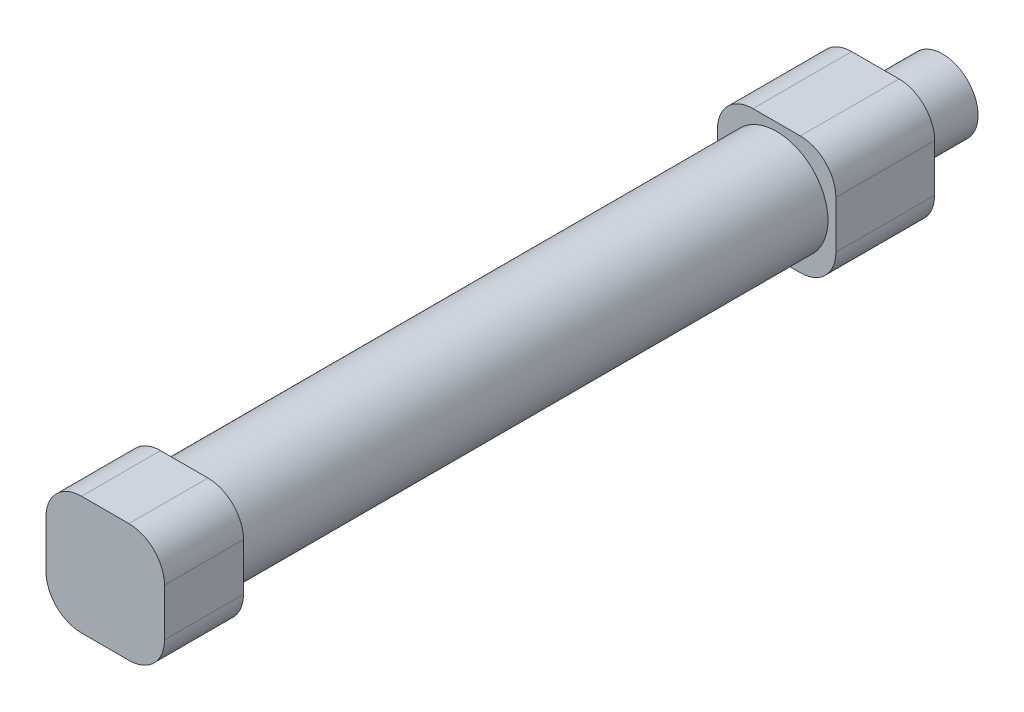
ISO-10303-21;
HEADER;
FILE_DESCRIPTION(('STEP AP214'),'2;1');
FILE_NAME('part.step','',(''),(''),'','','');
FILE_SCHEMA(('AUTOMOTIVE_DESIGN { 1 0 10303 214 1 1 1 1 }'));
ENDSEC;
DATA;
#1=APPLICATION_CONTEXT('core data for automotive mechanical design processes');
#2=APPLICATION_PROTOCOL_DEFINITION('international standard','automotive_design',2000,#1);
#3=PRODUCT_CONTEXT('',#1,'mechanical');
#4=PRODUCT('Part','Part','',(#3));
#5=PRODUCT_RELATED_PRODUCT_CATEGORY('part','',(#4));
#6=PRODUCT_DEFINITION_FORMATION('','',#4);
#7=PRODUCT_DEFINITION_CONTEXT('part definition',#1,'design');
#8=PRODUCT_DEFINITION('design','',#6,#7);
#9=PRODUCT_DEFINITION_SHAPE('','',#8);
#10=(LENGTH_UNIT() NAMED_UNIT(*) SI_UNIT(.MILLI.,.METRE.));
#11=(NAMED_UNIT(*) PLANE_ANGLE_UNIT() SI_UNIT($,.RADIAN.));
#12=(NAMED_UNIT(*) SI_UNIT($,.STERADIAN.) SOLID_ANGLE_UNIT());
#13=UNCERTAINTY_MEASURE_WITH_UNIT(LENGTH_MEASURE(1.E-05),#10,'distance_accuracy_value','');
#14=(GEOMETRIC_REPRESENTATION_CONTEXT(3) GLOBAL_UNCERTAINTY_ASSIGNED_CONTEXT((#13)) GLOBAL_UNIT_ASSIGNED_CONTEXT((#10,
#11,#12)) REPRESENTATION_CONTEXT('',''));
#15=CARTESIAN_POINT('',(0.,0.,0.));
#16=DIRECTION('',(0.,0.,1.));
#17=DIRECTION('',(1.,0.,0.));
#18=AXIS2_PLACEMENT_3D('',#15,#16,#17);
#19=CARTESIAN_POINT('',(7.5,-7.5,10.));
#20=DIRECTION('',(-1.,0.,0.));
#21=DIRECTION('',(0.,0.,1.));
#22=AXIS2_PLACEMENT_3D('',#19,#20,#21);
#23=PLANE('',#22);
#24=DIRECTION('',(0.,1.,0.));
#25=VECTOR('',#24,1.);
#26=CARTESIAN_POINT('',(7.5,-7.5,10.));
#27=LINE('',#26,#25);
#28=CARTESIAN_POINT('',(7.5,-3.,10.));
#29=VERTEX_POINT('',#28);
#30=CARTESIAN_POINT('',(7.5,3.,10.));
#31=VERTEX_POINT('',#30);
#32=EDGE_CURVE('E180',#29,#31,#27,.T.);
#33=ORIENTED_EDGE('',*,*,#32,.F.);
#34=DIRECTION('',(0.,0.,-1.));
#35=VECTOR('',#34,1.);
#36=CARTESIAN_POINT('',(7.5,-3.,10.));
#37=LINE('',#36,#35);
#38=CARTESIAN_POINT('',(7.5,-3.,0.));
#39=VERTEX_POINT('',#38);
#40=EDGE_CURVE('E212',#29,#39,#37,.T.);
#41=ORIENTED_EDGE('',*,*,#40,.T.);
#42=DIRECTION('',(0.,1.,0.));
#43=VECTOR('',#42,1.);
#44=CARTESIAN_POINT('',(7.5,-7.5,0.));
#45=LINE('',#44,#43);
#46=CARTESIAN_POINT('',(7.5,3.,0.));
#47=VERTEX_POINT('',#46);
#48=EDGE_CURVE('E281',#39,#47,#45,.T.);
#49=ORIENTED_EDGE('',*,*,#48,.T.);
#50=DIRECTION('',(0.,0.,-1.));
#51=VECTOR('',#50,1.);
#52=CARTESIAN_POINT('',(7.5,3.,10.));
#53=LINE('',#52,#51);
#54=EDGE_CURVE('E210',#47,#31,#53,.F.);
#55=ORIENTED_EDGE('',*,*,#54,.T.);
#56=EDGE_LOOP('',(#33,#41,#49,#55));
#57=FACE_BOUND('',#56,.T.);
#58=ADVANCED_FACE('F37',(#57),#23,.F.);
#59=CARTESIAN_POINT('',(-7.5,7.5,10.));
#60=DIRECTION('',(0.,-1.,0.));
#61=DIRECTION('',(0.,0.,-1.));
#62=AXIS2_PLACEMENT_3D('',#59,#60,#61);
#63=PLANE('',#62);
#64=DIRECTION('',(-1.,0.,0.));
#65=VECTOR('',#64,1.);
#66=CARTESIAN_POINT('',(-7.5,7.5,0.));
#67=LINE('',#66,#65);
#68=CARTESIAN_POINT('',(3.,7.5,0.));
#69=VERTEX_POINT('',#68);
#70=CARTESIAN_POINT('',(-3.,7.5,0.));
#71=VERTEX_POINT('',#70);
#72=EDGE_CURVE('E186',#69,#71,#67,.T.);
#73=ORIENTED_EDGE('',*,*,#72,.T.);
#74=DIRECTION('',(0.,0.,-1.));
#75=VECTOR('',#74,1.);
#76=CARTESIAN_POINT('',(-3.,7.5,10.));
#77=LINE('',#76,#75);
#78=CARTESIAN_POINT('',(-3.,7.5,10.));
#79=VERTEX_POINT('',#78);
#80=EDGE_CURVE('E208',#71,#79,#77,.F.);
#81=ORIENTED_EDGE('',*,*,#80,.T.);
#82=DIRECTION('',(-1.,0.,0.));
#83=VECTOR('',#82,1.);
#84=CARTESIAN_POINT('',(-7.5,7.5,10.));
#85=LINE('',#84,#83);
#86=CARTESIAN_POINT('',(3.,7.5,10.));
#87=VERTEX_POINT('',#86);
#88=EDGE_CURVE('E184',#87,#79,#85,.T.);
#89=ORIENTED_EDGE('',*,*,#88,.F.);
#90=DIRECTION('',(0.,0.,-1.));
#91=VECTOR('',#90,1.);
#92=CARTESIAN_POINT('',(3.,7.5,10.));
#93=LINE('',#92,#91);
#94=EDGE_CURVE('E205',#87,#69,#93,.T.);
#95=ORIENTED_EDGE('',*,*,#94,.T.);
#96=EDGE_LOOP('',(#73,#81,#89,#95));
#97=FACE_BOUND('',#96,.T.);
#98=ADVANCED_FACE('F295',(#97),#63,.F.);
#99=CARTESIAN_POINT('',(-7.5,-7.5,10.));
#100=DIRECTION('',(1.,0.,0.));
#101=DIRECTION('',(0.,0.,-1.));
#102=AXIS2_PLACEMENT_3D('',#99,#100,#101);
#103=PLANE('',#102);
#104=CARTESIAN_POINT('',(-7.5,0.,5.));
#105=DIRECTION('',(-1.,0.,0.));
#106=DIRECTION('',(0.,0.,1.));
#107=AXIS2_PLACEMENT_3D('',#104,#105,#106);
#108=CIRCLE('',#107,2.5);
#109=CARTESIAN_POINT('',(-7.5,0.,7.5));
#110=VERTEX_POINT('',#109);
#111=EDGE_CURVE('E274',#110,#110,#108,.T.);
#112=ORIENTED_EDGE('',*,*,#111,.F.);
#113=EDGE_LOOP('',(#112));
#114=FACE_BOUND('',#113,.T.);
#115=DIRECTION('',(0.,-1.,0.));
#116=VECTOR('',#115,1.);
#117=CARTESIAN_POINT('',(-7.5,-7.5,0.));
#118=LINE('',#117,#116);
#119=CARTESIAN_POINT('',(-7.5,3.,0.));
#120=VERTEX_POINT('',#119);
#121=CARTESIAN_POINT('',(-7.5,-3.,0.));
#122=VERTEX_POINT('',#121);
#123=EDGE_CURVE('E181',#120,#122,#118,.T.);
#124=ORIENTED_EDGE('',*,*,#123,.T.);
#125=DIRECTION('',(0.,0.,-1.));
#126=VECTOR('',#125,1.);
#127=CARTESIAN_POINT('',(-7.5,-3.,10.));
#128=LINE('',#127,#126);
#129=CARTESIAN_POINT('',(-7.5,-3.,10.));
#130=VERTEX_POINT('',#129);
#131=EDGE_CURVE('E158',#122,#130,#128,.F.);
#132=ORIENTED_EDGE('',*,*,#131,.T.);
#133=DIRECTION('',(0.,-1.,0.));
#134=VECTOR('',#133,1.);
#135=CARTESIAN_POINT('',(-7.5,-7.5,10.));
#136=LINE('',#135,#134);
#137=CARTESIAN_POINT('',(-7.5,3.,10.));
#138=VERTEX_POINT('',#137);
#139=EDGE_CURVE('E286',#138,#130,#136,.T.);
#140=ORIENTED_EDGE('',*,*,#139,.F.);
#141=DIRECTION('',(0.,0.,-1.));
#142=VECTOR('',#141,1.);
#143=CARTESIAN_POINT('',(-7.5,3.,10.));
#144=LINE('',#143,#142);
#145=EDGE_CURVE('E163',#138,#120,#144,.T.);
#146=ORIENTED_EDGE('',*,*,#145,.T.);
#147=EDGE_LOOP('',(#124,#132,#140,#146));
#148=FACE_BOUND('',#147,.T.);
#149=ADVANCED_FACE('F306',(#114,#148),#103,.F.);
#150=CARTESIAN_POINT('',(-7.5,-7.5,10.));
#151=DIRECTION('',(0.,1.,0.));
#152=DIRECTION('',(0.,0.,1.));
#153=AXIS2_PLACEMENT_3D('',#150,#151,#152);
#154=PLANE('',#153);
#155=DIRECTION('',(1.,0.,0.));
#156=VECTOR('',#155,1.);
#157=CARTESIAN_POINT('',(-7.5,-7.5,10.));
#158=LINE('',#157,#156);
#159=CARTESIAN_POINT('',(-3.,-7.5,10.));
#160=VERTEX_POINT('',#159);
#161=CARTESIAN_POINT('',(3.,-7.5,10.));
#162=VERTEX_POINT('',#161);
#163=EDGE_CURVE('E173',#160,#162,#158,.T.);
#164=ORIENTED_EDGE('',*,*,#163,.F.);
#165=DIRECTION('',(0.,0.,-1.));
#166=VECTOR('',#165,1.);
#167=CARTESIAN_POINT('',(-3.,-7.5,10.));
#168=LINE('',#167,#166);
#169=CARTESIAN_POINT('',(-3.,-7.5,0.));
#170=VERTEX_POINT('',#169);
#171=EDGE_CURVE('E157',#160,#170,#168,.T.);
#172=ORIENTED_EDGE('',*,*,#171,.T.);
#173=DIRECTION('',(1.,0.,0.));
#174=VECTOR('',#173,1.);
#175=CARTESIAN_POINT('',(-7.5,-7.5,0.));
#176=LINE('',#175,#174);
#177=CARTESIAN_POINT('',(3.,-7.5,0.));
#178=VERTEX_POINT('',#177);
#179=EDGE_CURVE('E170',#170,#178,#176,.T.);
#180=ORIENTED_EDGE('',*,*,#179,.T.);
#181=DIRECTION('',(0.,0.,-1.));
#182=VECTOR('',#181,1.);
#183=CARTESIAN_POINT('',(3.,-7.5,10.));
#184=LINE('',#183,#182);
#185=EDGE_CURVE('E175',#178,#162,#184,.F.);
#186=ORIENTED_EDGE('',*,*,#185,.T.);
#187=EDGE_LOOP('',(#164,#172,#180,#186));
#188=FACE_BOUND('',#187,.T.);
#189=ADVANCED_FACE('F169',(#188),#154,.F.);
#190=CARTESIAN_POINT('',(0.,0.,10.));
#191=DIRECTION('',(0.,0.,-1.));
#192=DIRECTION('',(-1.,0.,0.));
#193=AXIS2_PLACEMENT_3D('',#190,#191,#192);
#194=PLANE('',#193);
#195=ORIENTED_EDGE('',*,*,#139,.T.);
#196=CARTESIAN_POINT('',(-3.,-3.,10.));
#197=DIRECTION('',(0.,0.,-1.));
#198=DIRECTION('',(-1.,0.,0.));
#199=AXIS2_PLACEMENT_3D('',#196,#197,#198);
#200=CIRCLE('',#199,4.5);
#201=EDGE_CURVE('E203',#130,#160,#200,.F.);
#202=ORIENTED_EDGE('',*,*,#201,.T.);
#203=ORIENTED_EDGE('',*,*,#163,.T.);
#204=CARTESIAN_POINT('',(3.,-3.,10.));
#205=DIRECTION('',(0.,0.,-1.));
#206=DIRECTION('',(-1.,0.,0.));
#207=AXIS2_PLACEMENT_3D('',#204,#205,#206);
#208=CIRCLE('',#207,4.5);
#209=EDGE_CURVE('E199',#162,#29,#208,.F.);
#210=ORIENTED_EDGE('',*,*,#209,.T.);
#211=ORIENTED_EDGE('',*,*,#32,.T.);
#212=CARTESIAN_POINT('',(3.,3.,10.));
#213=DIRECTION('',(0.,0.,-1.));
#214=DIRECTION('',(-1.,0.,0.));
#215=AXIS2_PLACEMENT_3D('',#212,#213,#214);
#216=CIRCLE('',#215,4.5);
#217=EDGE_CURVE('E197',#31,#87,#216,.F.);
#218=ORIENTED_EDGE('',*,*,#217,.T.);
#219=ORIENTED_EDGE('',*,*,#88,.T.);
#220=CARTESIAN_POINT('',(-3.,3.,10.));
#221=DIRECTION('',(0.,0.,-1.));
#222=DIRECTION('',(-1.,0.,0.));
#223=AXIS2_PLACEMENT_3D('',#220,#221,#222);
#224=CIRCLE('',#223,4.5);
#225=EDGE_CURVE('E201',#79,#138,#224,.F.);
#226=ORIENTED_EDGE('',*,*,#225,.T.);
#227=EDGE_LOOP('',(#195,#202,#203,#210,#211,#218,#219,#226));
#228=FACE_BOUND('',#227,.T.);
#229=ADVANCED_FACE('F304',(#228),#194,.F.);
#230=CARTESIAN_POINT('',(0.,0.,0.));
#231=DIRECTION('',(0.,0.,-1.));
#232=DIRECTION('',(-1.,0.,0.));
#233=AXIS2_PLACEMENT_3D('',#230,#231,#232);
#234=PLANE('',#233);
#235=CARTESIAN_POINT('',(0.,0.,0.));
#236=DIRECTION('',(0.,0.,-1.));
#237=DIRECTION('',(-1.,0.,0.));
#238=AXIS2_PLACEMENT_3D('',#235,#236,#237);
#239=CIRCLE('',#238,6.5);
#240=CARTESIAN_POINT('',(-6.5,0.,0.));
#241=VERTEX_POINT('',#240);
#242=EDGE_CURVE('E215',#241,#241,#239,.T.);
#243=ORIENTED_EDGE('',*,*,#242,.F.);
#244=EDGE_LOOP('',(#243));
#245=FACE_BOUND('',#244,.T.);
#246=ORIENTED_EDGE('',*,*,#179,.F.);
#247=CARTESIAN_POINT('',(-3.,-3.,0.));
#248=DIRECTION('',(0.,0.,-1.));
#249=DIRECTION('',(-1.,0.,0.));
#250=AXIS2_PLACEMENT_3D('',#247,#248,#249);
#251=CIRCLE('',#250,4.5);
#252=EDGE_CURVE('E153',#170,#122,#251,.T.);
#253=ORIENTED_EDGE('',*,*,#252,.T.);
#254=ORIENTED_EDGE('',*,*,#123,.F.);
#255=CARTESIAN_POINT('',(-3.,3.,0.));
#256=DIRECTION('',(0.,0.,-1.));
#257=DIRECTION('',(-1.,0.,0.));
#258=AXIS2_PLACEMENT_3D('',#255,#256,#257);
#259=CIRCLE('',#258,4.5);
#260=EDGE_CURVE('E164',#120,#71,#259,.T.);
#261=ORIENTED_EDGE('',*,*,#260,.T.);
#262=ORIENTED_EDGE('',*,*,#72,.F.);
#263=CARTESIAN_POINT('',(3.,3.,0.));
#264=DIRECTION('',(0.,0.,-1.));
#265=DIRECTION('',(-1.,0.,0.));
#266=AXIS2_PLACEMENT_3D('',#263,#264,#265);
#267=CIRCLE('',#266,4.5);
#268=EDGE_CURVE('E174',#69,#47,#267,.T.);
#269=ORIENTED_EDGE('',*,*,#268,.T.);
#270=ORIENTED_EDGE('',*,*,#48,.F.);
#271=CARTESIAN_POINT('',(3.,-3.,0.));
#272=DIRECTION('',(0.,0.,-1.));
#273=DIRECTION('',(-1.,0.,0.));
#274=AXIS2_PLACEMENT_3D('',#271,#272,#273);
#275=CIRCLE('',#274,4.5);
#276=EDGE_CURVE('E179',#39,#178,#275,.T.);
#277=ORIENTED_EDGE('',*,*,#276,.T.);
#278=EDGE_LOOP('',(#246,#253,#254,#261,#262,#269,#270,#277));
#279=FACE_BOUND('',#278,.T.);
#280=ADVANCED_FACE('F177',(#245,#279),#234,.T.);
#281=CARTESIAN_POINT('',(-3.,-3.,10.));
#282=DIRECTION('',(0.,0.,-1.));
#283=DIRECTION('',(-1.,0.,0.));
#284=AXIS2_PLACEMENT_3D('',#281,#282,#283);
#285=CYLINDRICAL_SURFACE('',#284,4.5);
#286=ORIENTED_EDGE('',*,*,#201,.F.);
#287=ORIENTED_EDGE('',*,*,#131,.F.);
#288=ORIENTED_EDGE('',*,*,#252,.F.);
#289=ORIENTED_EDGE('',*,*,#171,.F.);
#290=EDGE_LOOP('',(#286,#287,#288,#289));
#291=FACE_BOUND('',#290,.T.);
#292=ADVANCED_FACE('F156',(#291),#285,.T.);
#293=CARTESIAN_POINT('',(-3.,3.,10.));
#294=DIRECTION('',(0.,0.,-1.));
#295=DIRECTION('',(-1.,0.,0.));
#296=AXIS2_PLACEMENT_3D('',#293,#294,#295);
#297=CYLINDRICAL_SURFACE('',#296,4.5);
#298=ORIENTED_EDGE('',*,*,#225,.F.);
#299=ORIENTED_EDGE('',*,*,#80,.F.);
#300=ORIENTED_EDGE('',*,*,#260,.F.);
#301=ORIENTED_EDGE('',*,*,#145,.F.);
#302=EDGE_LOOP('',(#298,#299,#300,#301));
#303=FACE_BOUND('',#302,.T.);
#304=ADVANCED_FACE('F300',(#303),#297,.T.);
#305=CARTESIAN_POINT('',(3.,-3.,10.));
#306=DIRECTION('',(0.,0.,-1.));
#307=DIRECTION('',(-1.,0.,0.));
#308=AXIS2_PLACEMENT_3D('',#305,#306,#307);
#309=CYLINDRICAL_SURFACE('',#308,4.5);
#310=ORIENTED_EDGE('',*,*,#209,.F.);
#311=ORIENTED_EDGE('',*,*,#185,.F.);
#312=ORIENTED_EDGE('',*,*,#276,.F.);
#313=ORIENTED_EDGE('',*,*,#40,.F.);
#314=EDGE_LOOP('',(#310,#311,#312,#313));
#315=FACE_BOUND('',#314,.T.);
#316=ADVANCED_FACE('F328',(#315),#309,.T.);
#317=CARTESIAN_POINT('',(3.,3.,10.));
#318=DIRECTION('',(0.,0.,-1.));
#319=DIRECTION('',(-1.,0.,0.));
#320=AXIS2_PLACEMENT_3D('',#317,#318,#319);
#321=CYLINDRICAL_SURFACE('',#320,4.5);
#322=ORIENTED_EDGE('',*,*,#217,.F.);
#323=ORIENTED_EDGE('',*,*,#54,.F.);
#324=ORIENTED_EDGE('',*,*,#268,.F.);
#325=ORIENTED_EDGE('',*,*,#94,.F.);
#326=EDGE_LOOP('',(#322,#323,#324,#325));
#327=FACE_BOUND('',#326,.T.);
#328=ADVANCED_FACE('F331',(#327),#321,.T.);
#329=CARTESIAN_POINT('',(-2.7,0.,5.));
#330=DIRECTION('',(-1.,0.,0.));
#331=DIRECTION('',(0.,0.,1.));
#332=AXIS2_PLACEMENT_3D('',#329,#330,#331);
#333=CYLINDRICAL_SURFACE('',#332,2.5);
#334=CARTESIAN_POINT('',(-2.7,0.,5.));
#335=DIRECTION('',(-1.,0.,0.));
#336=DIRECTION('',(0.,0.,1.));
#337=AXIS2_PLACEMENT_3D('',#334,#335,#336);
#338=CIRCLE('',#337,2.5);
#339=CARTESIAN_POINT('',(-2.7,0.,7.5));
#340=VERTEX_POINT('',#339);
#341=EDGE_CURVE('E278',#340,#340,#338,.T.);
#342=ORIENTED_EDGE('',*,*,#341,.F.);
#343=EDGE_LOOP('',(#342));
#344=FACE_BOUND('',#343,.T.);
#345=ORIENTED_EDGE('',*,*,#111,.T.);
#346=EDGE_LOOP('',(#345));
#347=FACE_BOUND('',#346,.T.);
#348=ADVANCED_FACE('F335',(#344,#347),#333,.F.);
#349=CARTESIAN_POINT('',(-2.7,0.,5.));
#350=DIRECTION('',(-1.,0.,0.));
#351=DIRECTION('',(0.,0.,1.));
#352=AXIS2_PLACEMENT_3D('',#349,#350,#351);
#353=PLANE('',#352);
#354=ORIENTED_EDGE('',*,*,#341,.T.);
#355=EDGE_LOOP('',(#354));
#356=FACE_BOUND('',#355,.T.);
#357=ADVANCED_FACE('F393',(#356),#353,.T.);
#358=CARTESIAN_POINT('',(0.,0.,-75.));
#359=DIRECTION('',(0.,0.,1.));
#360=DIRECTION('',(1.,0.,0.));
#361=AXIS2_PLACEMENT_3D('',#358,#359,#360);
#362=CYLINDRICAL_SURFACE('',#361,6.5);
#363=CARTESIAN_POINT('',(0.,0.,-75.));
#364=DIRECTION('',(0.,0.,-1.));
#365=DIRECTION('',(-1.,0.,0.));
#366=AXIS2_PLACEMENT_3D('',#363,#364,#365);
#367=CIRCLE('',#366,6.5);
#368=CARTESIAN_POINT('',(-6.5,0.,-75.));
#369=VERTEX_POINT('',#368);
#370=EDGE_CURVE('E271',#369,#369,#367,.T.);
#371=ORIENTED_EDGE('',*,*,#370,.F.);
#372=EDGE_LOOP('',(#371));
#373=FACE_BOUND('',#372,.T.);
#374=ORIENTED_EDGE('',*,*,#242,.T.);
#375=EDGE_LOOP('',(#374));
#376=FACE_BOUND('',#375,.T.);
#377=ADVANCED_FACE('F389',(#373,#376),#362,.T.);
#378=CARTESIAN_POINT('',(-7.5,-7.5,-87.5));
#379=DIRECTION('',(1.,0.,0.));
#380=DIRECTION('',(0.,0.,-1.));
#381=AXIS2_PLACEMENT_3D('',#378,#379,#380);
#382=PLANE('',#381);
#383=CARTESIAN_POINT('',(-7.5,0.,-79.5));
#384=DIRECTION('',(-1.,0.,0.));
#385=DIRECTION('',(0.,0.,1.));
#386=AXIS2_PLACEMENT_3D('',#383,#384,#385);
#387=CIRCLE('',#386,2.49999999999999);
#388=CARTESIAN_POINT('',(-7.5,0.,-77.));
#389=VERTEX_POINT('',#388);
#390=EDGE_CURVE('E571',#389,#389,#387,.T.);
#391=ORIENTED_EDGE('',*,*,#390,.F.);
#392=EDGE_LOOP('',(#391));
#393=FACE_BOUND('',#392,.T.);
#394=DIRECTION('',(0.,1.,0.));
#395=VECTOR('',#394,1.);
#396=CARTESIAN_POINT('',(-7.5,-7.5,-87.5));
#397=LINE('',#396,#395);
#398=CARTESIAN_POINT('',(-7.5,-3.,-87.5));
#399=VERTEX_POINT('',#398);
#400=CARTESIAN_POINT('',(-7.5,3.,-87.5));
#401=VERTEX_POINT('',#400);
#402=EDGE_CURVE('E270',#399,#401,#397,.T.);
#403=ORIENTED_EDGE('',*,*,#402,.F.);
#404=DIRECTION('',(0.,0.,1.));
#405=VECTOR('',#404,1.);
#406=CARTESIAN_POINT('',(-7.5,-3.,-87.5));
#407=LINE('',#406,#405);
#408=CARTESIAN_POINT('',(-7.5,-3.,-75.));
#409=VERTEX_POINT('',#408);
#410=EDGE_CURVE('E243',#399,#409,#407,.T.);
#411=ORIENTED_EDGE('',*,*,#410,.T.);
#412=DIRECTION('',(0.,1.,0.));
#413=VECTOR('',#412,1.);
#414=CARTESIAN_POINT('',(-7.5,-7.5,-75.));
#415=LINE('',#414,#413);
#416=CARTESIAN_POINT('',(-7.5,3.,-75.));
#417=VERTEX_POINT('',#416);
#418=EDGE_CURVE('E259',#409,#417,#415,.T.);
#419=ORIENTED_EDGE('',*,*,#418,.T.);
#420=DIRECTION('',(0.,0.,1.));
#421=VECTOR('',#420,1.);
#422=CARTESIAN_POINT('',(-7.5,3.,-87.5));
#423=LINE('',#422,#421);
#424=EDGE_CURVE('E241',#417,#401,#423,.F.);
#425=ORIENTED_EDGE('',*,*,#424,.T.);
#426=EDGE_LOOP('',(#403,#411,#419,#425));
#427=FACE_BOUND('',#426,.T.);
#428=ADVANCED_FACE('F354',(#393,#427),#382,.F.);
#429=CARTESIAN_POINT('',(7.5,7.5,-87.5));
#430=DIRECTION('',(0.,-1.,0.));
#431=DIRECTION('',(0.,0.,-1.));
#432=AXIS2_PLACEMENT_3D('',#429,#430,#431);
#433=PLANE('',#432);
#434=DIRECTION('',(1.,0.,0.));
#435=VECTOR('',#434,1.);
#436=CARTESIAN_POINT('',(7.5,7.5,-87.5));
#437=LINE('',#436,#435);
#438=CARTESIAN_POINT('',(-3.,7.5,-87.5));
#439=VERTEX_POINT('',#438);
#440=CARTESIAN_POINT('',(3.,7.5,-87.5));
#441=VERTEX_POINT('',#440);
#442=EDGE_CURVE('E250',#439,#441,#437,.T.);
#443=ORIENTED_EDGE('',*,*,#442,.F.);
#444=DIRECTION('',(0.,0.,1.));
#445=VECTOR('',#444,1.);
#446=CARTESIAN_POINT('',(-3.,7.5,-87.5));
#447=LINE('',#446,#445);
#448=CARTESIAN_POINT('',(-3.,7.5,-75.));
#449=VERTEX_POINT('',#448);
#450=EDGE_CURVE('E41',#439,#449,#447,.T.);
#451=ORIENTED_EDGE('',*,*,#450,.T.);
#452=DIRECTION('',(1.,0.,0.));
#453=VECTOR('',#452,1.);
#454=CARTESIAN_POINT('',(7.5,7.5,-75.));
#455=LINE('',#454,#453);
#456=CARTESIAN_POINT('',(3.,7.5,-75.));
#457=VERTEX_POINT('',#456);
#458=EDGE_CURVE('E249',#449,#457,#455,.T.);
#459=ORIENTED_EDGE('',*,*,#458,.T.);
#460=DIRECTION('',(0.,0.,1.));
#461=VECTOR('',#460,1.);
#462=CARTESIAN_POINT('',(3.,7.5,-87.5));
#463=LINE('',#462,#461);
#464=EDGE_CURVE('E53',#457,#441,#463,.F.);
#465=ORIENTED_EDGE('',*,*,#464,.T.);
#466=EDGE_LOOP('',(#443,#451,#459,#465));
#467=FACE_BOUND('',#466,.T.);
#468=ADVANCED_FACE('F248',(#467),#433,.F.);
#469=CARTESIAN_POINT('',(7.5,-7.5,-87.5));
#470=DIRECTION('',(-1.,0.,0.));
#471=DIRECTION('',(0.,0.,1.));
#472=AXIS2_PLACEMENT_3D('',#469,#470,#471);
#473=PLANE('',#472);
#474=DIRECTION('',(0.,-1.,0.));
#475=VECTOR('',#474,1.);
#476=CARTESIAN_POINT('',(7.5,-7.5,-75.));
#477=LINE('',#476,#475);
#478=CARTESIAN_POINT('',(7.5,3.,-75.));
#479=VERTEX_POINT('',#478);
#480=CARTESIAN_POINT('',(7.5,-3.,-75.));
#481=VERTEX_POINT('',#480);
#482=EDGE_CURVE('E258',#479,#481,#477,.T.);
#483=ORIENTED_EDGE('',*,*,#482,.T.);
#484=DIRECTION('',(0.,0.,1.));
#485=VECTOR('',#484,1.);
#486=CARTESIAN_POINT('',(7.5,-3.,-87.5));
#487=LINE('',#486,#485);
#488=CARTESIAN_POINT('',(7.5,-3.,-87.5));
#489=VERTEX_POINT('',#488);
#490=EDGE_CURVE('E232',#481,#489,#487,.F.);
#491=ORIENTED_EDGE('',*,*,#490,.T.);
#492=DIRECTION('',(0.,-1.,0.));
#493=VECTOR('',#492,1.);
#494=CARTESIAN_POINT('',(7.5,-7.5,-87.5));
#495=LINE('',#494,#493);
#496=CARTESIAN_POINT('',(7.5,3.,-87.5));
#497=VERTEX_POINT('',#496);
#498=EDGE_CURVE('E361',#497,#489,#495,.T.);
#499=ORIENTED_EDGE('',*,*,#498,.F.);
#500=DIRECTION('',(0.,0.,1.));
#501=VECTOR('',#500,1.);
#502=CARTESIAN_POINT('',(7.5,3.,-87.5));
#503=LINE('',#502,#501);
#504=EDGE_CURVE('E229',#497,#479,#503,.T.);
#505=ORIENTED_EDGE('',*,*,#504,.T.);
#506=EDGE_LOOP('',(#483,#491,#499,#505));
#507=FACE_BOUND('',#506,.T.);
#508=ADVANCED_FACE('F373',(#507),#473,.F.);
#509=CARTESIAN_POINT('',(7.5,-7.5,-87.5));
#510=DIRECTION('',(0.,1.,0.));
#511=DIRECTION('',(0.,0.,1.));
#512=AXIS2_PLACEMENT_3D('',#509,#510,#511);
#513=PLANE('',#512);
#514=DIRECTION('',(-1.,0.,0.));
#515=VECTOR('',#514,1.);
#516=CARTESIAN_POINT('',(7.5,-7.5,-87.5));
#517=LINE('',#516,#515);
#518=CARTESIAN_POINT('',(3.,-7.5,-87.5));
#519=VERTEX_POINT('',#518);
#520=CARTESIAN_POINT('',(-3.,-7.5,-87.5));
#521=VERTEX_POINT('',#520);
#522=EDGE_CURVE('E275',#519,#521,#517,.T.);
#523=ORIENTED_EDGE('',*,*,#522,.F.);
#524=DIRECTION('',(0.,0.,1.));
#525=VECTOR('',#524,1.);
#526=CARTESIAN_POINT('',(3.,-7.5,-87.5));
#527=LINE('',#526,#525);
#528=CARTESIAN_POINT('',(3.,-7.5,-75.));
#529=VERTEX_POINT('',#528);
#530=EDGE_CURVE('E218',#519,#529,#527,.T.);
#531=ORIENTED_EDGE('',*,*,#530,.T.);
#532=DIRECTION('',(-1.,0.,0.));
#533=VECTOR('',#532,1.);
#534=CARTESIAN_POINT('',(7.5,-7.5,-75.));
#535=LINE('',#534,#533);
#536=CARTESIAN_POINT('',(-3.,-7.5,-75.));
#537=VERTEX_POINT('',#536);
#538=EDGE_CURVE('E262',#529,#537,#535,.T.);
#539=ORIENTED_EDGE('',*,*,#538,.T.);
#540=DIRECTION('',(0.,0.,1.));
#541=VECTOR('',#540,1.);
#542=CARTESIAN_POINT('',(-3.,-7.5,-87.5));
#543=LINE('',#542,#541);
#544=EDGE_CURVE('E216',#537,#521,#543,.F.);
#545=ORIENTED_EDGE('',*,*,#544,.T.);
#546=EDGE_LOOP('',(#523,#531,#539,#545));
#547=FACE_BOUND('',#546,.T.);
#548=ADVANCED_FACE('F370',(#547),#513,.F.);
#549=CARTESIAN_POINT('',(0.,0.,-87.5));
#550=DIRECTION('',(0.,0.,1.));
#551=DIRECTION('',(1.,0.,0.));
#552=AXIS2_PLACEMENT_3D('',#549,#550,#551);
#553=PLANE('',#552);
#554=CARTESIAN_POINT('',(0.,0.,-87.5));
#555=DIRECTION('',(0.,0.,-1.));
#556=DIRECTION('',(-1.,0.,0.));
#557=AXIS2_PLACEMENT_3D('',#554,#555,#556);
#558=CIRCLE('',#557,4.5);
#559=CARTESIAN_POINT('',(-4.5,0.,-87.5));
#560=VERTEX_POINT('',#559);
#561=EDGE_CURVE('E11',#560,#560,#558,.T.);
#562=ORIENTED_EDGE('',*,*,#561,.F.);
#563=EDGE_LOOP('',(#562));
#564=FACE_BOUND('',#563,.T.);
#565=ORIENTED_EDGE('',*,*,#498,.T.);
#566=CARTESIAN_POINT('',(3.,-3.,-87.5));
#567=DIRECTION('',(0.,0.,1.));
#568=DIRECTION('',(1.,0.,0.));
#569=AXIS2_PLACEMENT_3D('',#566,#567,#568);
#570=CIRCLE('',#569,4.5);
#571=EDGE_CURVE('E239',#489,#519,#570,.F.);
#572=ORIENTED_EDGE('',*,*,#571,.T.);
#573=ORIENTED_EDGE('',*,*,#522,.T.);
#574=CARTESIAN_POINT('',(-3.,-3.,-87.5));
#575=DIRECTION('',(0.,0.,1.));
#576=DIRECTION('',(1.,0.,0.));
#577=AXIS2_PLACEMENT_3D('',#574,#575,#576);
#578=CIRCLE('',#577,4.5);
#579=EDGE_CURVE('E237',#521,#399,#578,.F.);
#580=ORIENTED_EDGE('',*,*,#579,.T.);
#581=ORIENTED_EDGE('',*,*,#402,.T.);
#582=CARTESIAN_POINT('',(-3.,3.,-87.5));
#583=DIRECTION('',(0.,0.,1.));
#584=DIRECTION('',(1.,0.,0.));
#585=AXIS2_PLACEMENT_3D('',#582,#583,#584);
#586=CIRCLE('',#585,4.5);
#587=EDGE_CURVE('E60',#401,#439,#586,.F.);
#588=ORIENTED_EDGE('',*,*,#587,.T.);
#589=ORIENTED_EDGE('',*,*,#442,.T.);
#590=CARTESIAN_POINT('',(3.,3.,-87.5));
#591=DIRECTION('',(0.,0.,1.));
#592=DIRECTION('',(1.,0.,0.));
#593=AXIS2_PLACEMENT_3D('',#590,#591,#592);
#594=CIRCLE('',#593,4.5);
#595=EDGE_CURVE('E234',#441,#497,#594,.F.);
#596=ORIENTED_EDGE('',*,*,#595,.T.);
#597=EDGE_LOOP('',(#565,#572,#573,#580,#581,#588,#589,#596));
#598=FACE_BOUND('',#597,.T.);
#599=ADVANCED_FACE('F357',(#564,#598),#553,.F.);
#600=CARTESIAN_POINT('',(0.,0.,-75.));
#601=DIRECTION('',(0.,0.,1.));
#602=DIRECTION('',(1.,0.,0.));
#603=AXIS2_PLACEMENT_3D('',#600,#601,#602);
#604=PLANE('',#603);
#605=ORIENTED_EDGE('',*,*,#370,.T.);
#606=EDGE_LOOP('',(#605));
#607=FACE_BOUND('',#606,.T.);
#608=ORIENTED_EDGE('',*,*,#538,.F.);
#609=CARTESIAN_POINT('',(3.,-3.,-75.));
#610=DIRECTION('',(0.,0.,1.));
#611=DIRECTION('',(1.,0.,0.));
#612=AXIS2_PLACEMENT_3D('',#609,#610,#611);
#613=CIRCLE('',#612,4.5);
#614=EDGE_CURVE('E227',#529,#481,#613,.T.);
#615=ORIENTED_EDGE('',*,*,#614,.T.);
#616=ORIENTED_EDGE('',*,*,#482,.F.);
#617=CARTESIAN_POINT('',(3.,3.,-75.));
#618=DIRECTION('',(0.,0.,1.));
#619=DIRECTION('',(1.,0.,0.));
#620=AXIS2_PLACEMENT_3D('',#617,#618,#619);
#621=CIRCLE('',#620,4.5);
#622=EDGE_CURVE('E221',#479,#457,#621,.T.);
#623=ORIENTED_EDGE('',*,*,#622,.T.);
#624=ORIENTED_EDGE('',*,*,#458,.F.);
#625=CARTESIAN_POINT('',(-3.,3.,-75.));
#626=DIRECTION('',(0.,0.,1.));
#627=DIRECTION('',(1.,0.,0.));
#628=AXIS2_PLACEMENT_3D('',#625,#626,#627);
#629=CIRCLE('',#628,4.5);
#630=EDGE_CURVE('E223',#449,#417,#629,.T.);
#631=ORIENTED_EDGE('',*,*,#630,.T.);
#632=ORIENTED_EDGE('',*,*,#418,.F.);
#633=CARTESIAN_POINT('',(-3.,-3.,-75.));
#634=DIRECTION('',(0.,0.,1.));
#635=DIRECTION('',(1.,0.,0.));
#636=AXIS2_PLACEMENT_3D('',#633,#634,#635);
#637=CIRCLE('',#636,4.5);
#638=EDGE_CURVE('E225',#409,#537,#637,.T.);
#639=ORIENTED_EDGE('',*,*,#638,.T.);
#640=EDGE_LOOP('',(#608,#615,#616,#623,#624,#631,#632,#639));
#641=FACE_BOUND('',#640,.T.);
#642=ADVANCED_FACE('F254',(#607,#641),#604,.T.);
#643=CARTESIAN_POINT('',(3.,-3.,-87.5));
#644=DIRECTION('',(0.,0.,1.));
#645=DIRECTION('',(1.,0.,0.));
#646=AXIS2_PLACEMENT_3D('',#643,#644,#645);
#647=CYLINDRICAL_SURFACE('',#646,4.5);
#648=ORIENTED_EDGE('',*,*,#571,.F.);
#649=ORIENTED_EDGE('',*,*,#490,.F.);
#650=ORIENTED_EDGE('',*,*,#614,.F.);
#651=ORIENTED_EDGE('',*,*,#530,.F.);
#652=EDGE_LOOP('',(#648,#649,#650,#651));
#653=FACE_BOUND('',#652,.T.);
#654=ADVANCED_FACE('F337',(#653),#647,.T.);
#655=CARTESIAN_POINT('',(-3.,-3.,-87.5));
#656=DIRECTION('',(0.,0.,1.));
#657=DIRECTION('',(1.,0.,0.));
#658=AXIS2_PLACEMENT_3D('',#655,#656,#657);
#659=CYLINDRICAL_SURFACE('',#658,4.5);
#660=ORIENTED_EDGE('',*,*,#579,.F.);
#661=ORIENTED_EDGE('',*,*,#544,.F.);
#662=ORIENTED_EDGE('',*,*,#638,.F.);
#663=ORIENTED_EDGE('',*,*,#410,.F.);
#664=EDGE_LOOP('',(#660,#661,#662,#663));
#665=FACE_BOUND('',#664,.T.);
#666=ADVANCED_FACE('F340',(#665),#659,.T.);
#667=CARTESIAN_POINT('',(-3.,3.,-87.5));
#668=DIRECTION('',(0.,0.,1.));
#669=DIRECTION('',(1.,0.,0.));
#670=AXIS2_PLACEMENT_3D('',#667,#668,#669);
#671=CYLINDRICAL_SURFACE('',#670,4.5);
#672=ORIENTED_EDGE('',*,*,#587,.F.);
#673=ORIENTED_EDGE('',*,*,#424,.F.);
#674=ORIENTED_EDGE('',*,*,#630,.F.);
#675=ORIENTED_EDGE('',*,*,#450,.F.);
#676=EDGE_LOOP('',(#672,#673,#674,#675));
#677=FACE_BOUND('',#676,.T.);
#678=ADVANCED_FACE('F343',(#677),#671,.T.);
#679=CARTESIAN_POINT('',(3.,3.,-87.5));
#680=DIRECTION('',(0.,0.,1.));
#681=DIRECTION('',(1.,0.,0.));
#682=AXIS2_PLACEMENT_3D('',#679,#680,#681);
#683=CYLINDRICAL_SURFACE('',#682,4.5);
#684=ORIENTED_EDGE('',*,*,#595,.F.);
#685=ORIENTED_EDGE('',*,*,#464,.F.);
#686=ORIENTED_EDGE('',*,*,#622,.F.);
#687=ORIENTED_EDGE('',*,*,#504,.F.);
#688=EDGE_LOOP('',(#684,#685,#686,#687));
#689=FACE_BOUND('',#688,.T.);
#690=ADVANCED_FACE('F39',(#689),#683,.T.);
#691=CARTESIAN_POINT('',(0.,0.,-96.));
#692=DIRECTION('',(0.,0.,1.));
#693=DIRECTION('',(1.,0.,0.));
#694=AXIS2_PLACEMENT_3D('',#691,#692,#693);
#695=CYLINDRICAL_SURFACE('',#694,4.5);
#696=CARTESIAN_POINT('',(0.,0.,-96.));
#697=DIRECTION('',(0.,0.,-1.));
#698=DIRECTION('',(-1.,0.,0.));
#699=AXIS2_PLACEMENT_3D('',#696,#697,#698);
#700=CIRCLE('',#699,4.5);
#701=CARTESIAN_POINT('',(-4.5,0.,-96.));
#702=VERTEX_POINT('',#701);
#703=EDGE_CURVE('E264',#702,#702,#700,.T.);
#704=ORIENTED_EDGE('',*,*,#703,.F.);
#705=EDGE_LOOP('',(#704));
#706=FACE_BOUND('',#705,.T.);
#707=ORIENTED_EDGE('',*,*,#561,.T.);
#708=EDGE_LOOP('',(#707));
#709=FACE_BOUND('',#708,.T.);
#710=ADVANCED_FACE('F349',(#706,#709),#695,.T.);
#711=CARTESIAN_POINT('',(0.,0.,-96.));
#712=DIRECTION('',(0.,0.,-1.));
#713=DIRECTION('',(-1.,0.,0.));
#714=AXIS2_PLACEMENT_3D('',#711,#712,#713);
#715=PLANE('',#714);
#716=CARTESIAN_POINT('',(0.,0.,-96.));
#717=DIRECTION('',(0.,0.,-1.));
#718=DIRECTION('',(-1.,0.,0.));
#719=AXIS2_PLACEMENT_3D('',#716,#717,#718);
#720=CIRCLE('',#719,2.5);
#721=CARTESIAN_POINT('',(-2.5,0.,-96.));
#722=VERTEX_POINT('',#721);
#723=EDGE_CURVE('E566',#722,#722,#720,.T.);
#724=ORIENTED_EDGE('',*,*,#723,.F.);
#725=EDGE_LOOP('',(#724));
#726=FACE_BOUND('',#725,.T.);
#727=ORIENTED_EDGE('',*,*,#703,.T.);
#728=EDGE_LOOP('',(#727));
#729=FACE_BOUND('',#728,.T.);
#730=ADVANCED_FACE('F506',(#726,#729),#715,.T.);
#731=CARTESIAN_POINT('',(-2.7,0.,-79.5));
#732=DIRECTION('',(-1.,0.,0.));
#733=DIRECTION('',(0.,0.,1.));
#734=AXIS2_PLACEMENT_3D('',#731,#732,#733);
#735=CYLINDRICAL_SURFACE('',#734,2.49999999999999);
#736=CARTESIAN_POINT('',(-2.7,0.,-79.5));
#737=DIRECTION('',(-1.,0.,0.));
#738=DIRECTION('',(0.,0.,1.));
#739=AXIS2_PLACEMENT_3D('',#736,#737,#738);
#740=CIRCLE('',#739,2.49999999999999);
#741=CARTESIAN_POINT('',(-2.7,0.,-77.));
#742=VERTEX_POINT('',#741);
#743=EDGE_CURVE('E569',#742,#742,#740,.T.);
#744=ORIENTED_EDGE('',*,*,#743,.F.);
#745=EDGE_LOOP('',(#744));
#746=FACE_BOUND('',#745,.T.);
#747=ORIENTED_EDGE('',*,*,#390,.T.);
#748=EDGE_LOOP('',(#747));
#749=FACE_BOUND('',#748,.T.);
#750=ADVANCED_FACE('F516',(#746,#749),#735,.F.);
#751=CARTESIAN_POINT('',(-2.7,0.,-79.5));
#752=DIRECTION('',(-1.,0.,0.));
#753=DIRECTION('',(0.,0.,1.));
#754=AXIS2_PLACEMENT_3D('',#751,#752,#753);
#755=PLANE('',#754);
#756=ORIENTED_EDGE('',*,*,#743,.T.);
#757=EDGE_LOOP('',(#756));
#758=FACE_BOUND('',#757,.T.);
#759=ADVANCED_FACE('F519',(#758),#755,.T.);
#760=CARTESIAN_POINT('',(0.,0.,-36.));
#761=DIRECTION('',(0.,0.,-1.));
#762=DIRECTION('',(-1.,0.,0.));
#763=AXIS2_PLACEMENT_3D('',#760,#761,#762);
#764=CYLINDRICAL_SURFACE('',#763,2.5);
#765=CARTESIAN_POINT('',(0.,0.,-36.));
#766=DIRECTION('',(0.,0.,-1.));
#767=DIRECTION('',(-1.,0.,0.));
#768=AXIS2_PLACEMENT_3D('',#765,#766,#767);
#769=CIRCLE('',#768,2.5);
#770=CARTESIAN_POINT('',(-2.5,0.,-36.));
#771=VERTEX_POINT('',#770);
#772=EDGE_CURVE('E575',#771,#771,#769,.T.);
#773=ORIENTED_EDGE('',*,*,#772,.F.);
#774=EDGE_LOOP('',(#773));
#775=FACE_BOUND('',#774,.T.);
#776=ORIENTED_EDGE('',*,*,#723,.T.);
#777=EDGE_LOOP('',(#776));
#778=FACE_BOUND('',#777,.T.);
#779=ADVANCED_FACE('F531',(#775,#778),#764,.F.);
#780=CARTESIAN_POINT('',(0.,0.,-36.));
#781=DIRECTION('',(0.,0.,-1.));
#782=DIRECTION('',(-1.,0.,0.));
#783=AXIS2_PLACEMENT_3D('',#780,#781,#782);
#784=PLANE('',#783);
#785=ORIENTED_EDGE('',*,*,#772,.T.);
#786=EDGE_LOOP('',(#785));
#787=FACE_BOUND('',#786,.T.);
#788=ADVANCED_FACE('F539',(#787),#784,.T.);
#789=CLOSED_SHELL('',(#58,#98,#149,#189,#229,#280,#292,#304,#316,#328,#348,#357,#377,#428,#468,
#508,#548,#599,#642,#654,#666,#678,#690,#710,#730,#750,#759,#779,#788));
#790=MANIFOLD_SOLID_BREP('B2',#789);
#791=ADVANCED_BREP_SHAPE_REPRESENTATION('',(#18,#790),#14);
#792=SHAPE_DEFINITION_REPRESENTATION(#9,#791);
ENDSEC;
END-ISO-10303-21;
